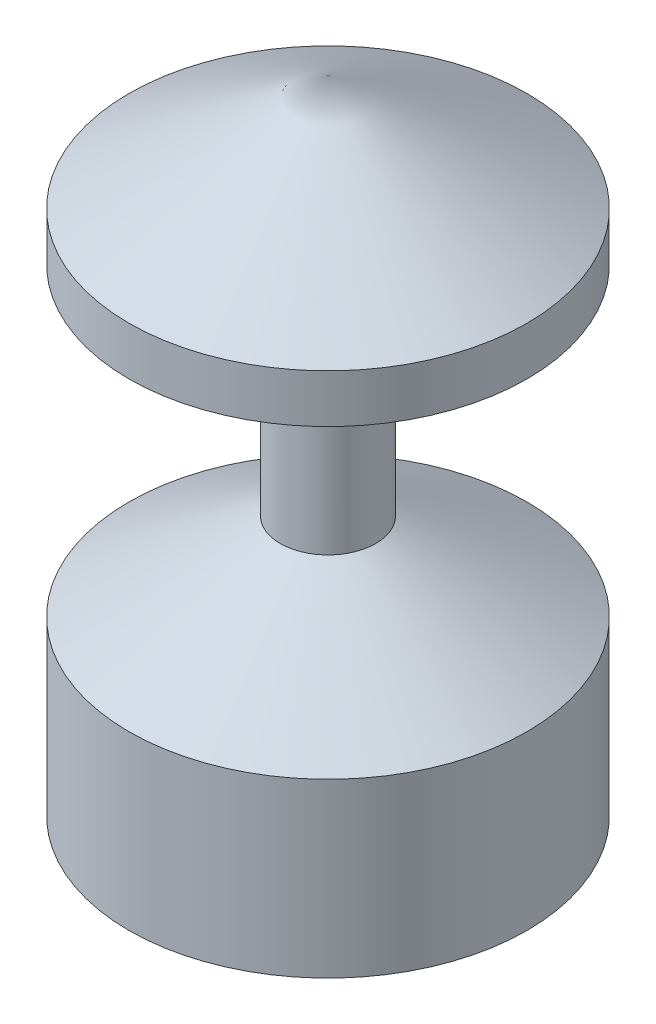
ISO-10303-21;
HEADER;
FILE_DESCRIPTION(('STEP AP214'),'2;1');
FILE_NAME('part.step','',(''),(''),'','','');
FILE_SCHEMA(('AUTOMOTIVE_DESIGN { 1 0 10303 214 1 1 1 1 }'));
ENDSEC;
DATA;
#1=APPLICATION_CONTEXT('core data for automotive mechanical design processes');
#2=APPLICATION_PROTOCOL_DEFINITION('international standard','automotive_design',2000,#1);
#3=PRODUCT_CONTEXT('',#1,'mechanical');
#4=PRODUCT('Part','Part','',(#3));
#5=PRODUCT_RELATED_PRODUCT_CATEGORY('part','',(#4));
#6=PRODUCT_DEFINITION_FORMATION('','',#4);
#7=PRODUCT_DEFINITION_CONTEXT('part definition',#1,'design');
#8=PRODUCT_DEFINITION('design','',#6,#7);
#9=PRODUCT_DEFINITION_SHAPE('','',#8);
#10=(LENGTH_UNIT() NAMED_UNIT(*) SI_UNIT(.MILLI.,.METRE.));
#11=(NAMED_UNIT(*) PLANE_ANGLE_UNIT() SI_UNIT($,.RADIAN.));
#12=(NAMED_UNIT(*) SI_UNIT($,.STERADIAN.) SOLID_ANGLE_UNIT());
#13=UNCERTAINTY_MEASURE_WITH_UNIT(LENGTH_MEASURE(1.E-05),#10,'distance_accuracy_value','');
#14=(GEOMETRIC_REPRESENTATION_CONTEXT(3) GLOBAL_UNCERTAINTY_ASSIGNED_CONTEXT((#13)) GLOBAL_UNIT_ASSIGNED_CONTEXT((#10,
#11,#12)) REPRESENTATION_CONTEXT('',''));
#15=CARTESIAN_POINT('',(0.,0.,0.));
#16=DIRECTION('',(0.,0.,1.));
#17=DIRECTION('',(1.,0.,0.));
#18=AXIS2_PLACEMENT_3D('',#15,#16,#17);
#19=CARTESIAN_POINT('',(0.,39.25,0.));
#20=DIRECTION('',(0.,-1.,0.));
#21=DIRECTION('',(0.,0.,-1.));
#22=AXIS2_PLACEMENT_3D('',#19,#20,#21);
#23=CONICAL_SURFACE('',#22,0.,1.0471975511966);
#24=CARTESIAN_POINT('',(0.,32.0331216351297,0.));
#25=DIRECTION('',(0.,1.,0.));
#26=DIRECTION('',(0.,0.,1.));
#27=AXIS2_PLACEMENT_3D('',#24,#25,#26);
#28=CIRCLE('',#27,12.5);
#29=CARTESIAN_POINT('',(0.,32.0331216351297,12.5));
#30=VERTEX_POINT('',#29);
#31=EDGE_CURVE('E11',#30,#30,#28,.T.);
#32=ORIENTED_EDGE('',*,*,#31,.T.);
#33=EDGE_LOOP('',(#32));
#34=FACE_BOUND('',#33,.T.);
#35=CARTESIAN_POINT('',(0.,39.25,0.));
#36=VERTEX_POINT('',#35);
#37=VERTEX_LOOP('',#36);
#38=FACE_BOUND('',#37,.T.);
#39=ADVANCED_FACE('F33',(#34,#38),#23,.T.);
#40=CARTESIAN_POINT('',(0.,39.25,0.));
#41=DIRECTION('',(0.,1.,0.));
#42=DIRECTION('',(0.,0.,1.));
#43=AXIS2_PLACEMENT_3D('',#40,#41,#42);
#44=CYLINDRICAL_SURFACE('',#43,12.5);
#45=CARTESIAN_POINT('',(0.,29.,0.));
#46=DIRECTION('',(0.,1.,0.));
#47=DIRECTION('',(0.,0.,1.));
#48=AXIS2_PLACEMENT_3D('',#45,#46,#47);
#49=CIRCLE('',#48,12.5);
#50=CARTESIAN_POINT('',(0.,29.,12.5));
#51=VERTEX_POINT('',#50);
#52=EDGE_CURVE('E40',#51,#51,#49,.T.);
#53=ORIENTED_EDGE('',*,*,#52,.T.);
#54=EDGE_LOOP('',(#53));
#55=FACE_BOUND('',#54,.T.);
#56=ORIENTED_EDGE('',*,*,#31,.F.);
#57=EDGE_LOOP('',(#56));
#58=FACE_BOUND('',#57,.T.);
#59=ADVANCED_FACE('F47',(#55,#58),#44,.T.);
#60=CARTESIAN_POINT('',(0.,29.,3.));
#61=DIRECTION('',(0.,-1.,0.));
#62=DIRECTION('',(0.,0.,-1.));
#63=AXIS2_PLACEMENT_3D('',#60,#61,#62);
#64=PLANE('',#63);
#65=CARTESIAN_POINT('',(0.,29.,0.));
#66=DIRECTION('',(0.,1.,0.));
#67=DIRECTION('',(0.,0.,1.));
#68=AXIS2_PLACEMENT_3D('',#65,#66,#67);
#69=CIRCLE('',#68,3.);
#70=CARTESIAN_POINT('',(0.,29.,3.));
#71=VERTEX_POINT('',#70);
#72=EDGE_CURVE('E105',#71,#71,#69,.T.);
#73=ORIENTED_EDGE('',*,*,#72,.T.);
#74=EDGE_LOOP('',(#73));
#75=FACE_BOUND('',#74,.T.);
#76=ORIENTED_EDGE('',*,*,#52,.F.);
#77=EDGE_LOOP('',(#76));
#78=FACE_BOUND('',#77,.T.);
#79=ADVANCED_FACE('F52',(#75,#78),#64,.T.);
#80=CARTESIAN_POINT('',(0.,39.25,0.));
#81=DIRECTION('',(0.,1.,0.));
#82=DIRECTION('',(0.,0.,1.));
#83=AXIS2_PLACEMENT_3D('',#80,#81,#82);
#84=CYLINDRICAL_SURFACE('',#83,3.);
#85=CARTESIAN_POINT('',(0.,15.2997821335251,0.));
#86=DIRECTION('',(0.,1.,0.));
#87=DIRECTION('',(0.,0.,1.));
#88=AXIS2_PLACEMENT_3D('',#85,#86,#87);
#89=CIRCLE('',#88,3.);
#90=CARTESIAN_POINT('',(0.,15.2997821335251,-3.));
#91=VERTEX_POINT('',#90);
#92=EDGE_CURVE('E102',#91,#91,#89,.T.);
#93=ORIENTED_EDGE('',*,*,#92,.T.);
#94=EDGE_LOOP('',(#93));
#95=FACE_BOUND('',#94,.T.);
#96=ORIENTED_EDGE('',*,*,#72,.F.);
#97=EDGE_LOOP('',(#96));
#98=FACE_BOUND('',#97,.T.);
#99=ADVANCED_FACE('F59',(#95,#98),#84,.T.);
#100=CARTESIAN_POINT('',(0.,15.2997821335251,0.));
#101=DIRECTION('',(0.,-1.,0.));
#102=DIRECTION('',(0.,0.,-1.));
#103=AXIS2_PLACEMENT_3D('',#100,#101,#102);
#104=CONICAL_SURFACE('',#103,3.,1.0471975511966);
#105=CARTESIAN_POINT('',(0.,9.81495457622364,0.));
#106=DIRECTION('',(0.,1.,0.));
#107=DIRECTION('',(0.,0.,1.));
#108=AXIS2_PLACEMENT_3D('',#105,#106,#107);
#109=CIRCLE('',#108,12.5);
#110=CARTESIAN_POINT('',(0.,9.81495457622364,-12.5));
#111=VERTEX_POINT('',#110);
#112=EDGE_CURVE('E99',#111,#111,#109,.T.);
#113=CARTESIAN_POINT('',(0.,9.81495457622364,-12.5));
#114=CARTESIAN_POINT('',(0.,9.8720881966122,-12.4010416666667));
#115=CARTESIAN_POINT('',(0.,9.92922181700075,-12.3020833333333));
#116=CARTESIAN_POINT('',(0.,10.0434890577779,-12.1041666666667));
#117=CARTESIAN_POINT('',(0.,10.1006226781664,-12.0052083333333));
#118=CARTESIAN_POINT('',(0.,10.2148899189435,-11.8072916666667));
#119=CARTESIAN_POINT('',(0.,10.2720235393321,-11.7083333333333));
#120=CARTESIAN_POINT('',(0.,10.3862907801092,-11.5104166666667));
#121=CARTESIAN_POINT('',(0.,10.4434244004978,-11.4114583333333));
#122=CARTESIAN_POINT('',(0.,10.5576916412749,-11.2135416666667));
#123=CARTESIAN_POINT('',(0.,10.6148252616634,-11.1145833333333));
#124=CARTESIAN_POINT('',(0.,10.7290925024406,-10.9166666666667));
#125=CARTESIAN_POINT('',(0.,10.7862261228291,-10.8177083333333));
#126=CARTESIAN_POINT('',(0.,10.9004933636062,-10.6197916666667));
#127=CARTESIAN_POINT('',(0.,10.9576269839948,-10.5208333333333));
#128=CARTESIAN_POINT('',(0.,11.0718942247719,-10.3229166666667));
#129=CARTESIAN_POINT('',(0.,11.1290278451605,-10.2239583333333));
#130=CARTESIAN_POINT('',(0.,11.2432950859376,-10.0260416666667));
#131=CARTESIAN_POINT('',(0.,11.3004287063261,-9.92708333333333));
#132=CARTESIAN_POINT('',(0.,11.4146959471032,-9.72916666666666));
#133=CARTESIAN_POINT('',(0.,11.4718295674918,-9.63020833333333));
#134=CARTESIAN_POINT('',(0.,11.5860968082689,-9.43229166666667));
#135=CARTESIAN_POINT('',(0.,11.6432304286575,-9.33333333333333));
#136=CARTESIAN_POINT('',(0.,11.7574976694346,-9.13541666666666));
#137=CARTESIAN_POINT('',(0.,11.8146312898231,-9.03645833333333));
#138=CARTESIAN_POINT('',(0.,11.9288985306002,-8.83854166666666));
#139=CARTESIAN_POINT('',(0.,11.9860321509888,-8.73958333333333));
#140=CARTESIAN_POINT('',(0.,12.1002993917659,-8.54166666666666));
#141=CARTESIAN_POINT('',(0.,12.1574330121545,-8.44270833333333));
#142=CARTESIAN_POINT('',(0.,12.2717002529316,-8.24479166666666));
#143=CARTESIAN_POINT('',(0.,12.3288338733201,-8.14583333333333));
#144=CARTESIAN_POINT('',(0.,12.4431011140973,-7.94791666666666));
#145=CARTESIAN_POINT('',(0.,12.5002347344858,-7.84895833333333));
#146=CARTESIAN_POINT('',(0.,12.6145019752629,-7.65104166666666));
#147=CARTESIAN_POINT('',(0.,12.6716355956515,-7.55208333333333));
#148=CARTESIAN_POINT('',(0.,12.7859028364286,-7.35416666666666));
#149=CARTESIAN_POINT('',(0.,12.8430364568172,-7.25520833333333));
#150=CARTESIAN_POINT('',(0.,12.9573036975943,-7.05729166666666));
#151=CARTESIAN_POINT('',(0.,13.0144373179828,-6.95833333333333));
#152=CARTESIAN_POINT('',(0.,13.1287045587599,-6.76041666666666));
#153=CARTESIAN_POINT('',(0.,13.1858381791485,-6.66145833333333));
#154=CARTESIAN_POINT('',(0.,13.3001054199256,-6.46354166666666));
#155=CARTESIAN_POINT('',(0.,13.3572390403142,-6.36458333333333));
#156=CARTESIAN_POINT('',(0.,13.4715062810913,-6.16666666666666));
#157=CARTESIAN_POINT('',(0.,13.5286399014798,-6.06770833333333));
#158=CARTESIAN_POINT('',(0.,13.642907142257,-5.86979166666666));
#159=CARTESIAN_POINT('',(0.,13.7000407626455,-5.77083333333333));
#160=CARTESIAN_POINT('',(0.,13.8143080034226,-5.57291666666666));
#161=CARTESIAN_POINT('',(0.,13.8714416238112,-5.47395833333333));
#162=CARTESIAN_POINT('',(0.,13.9857088645883,-5.27604166666666));
#163=CARTESIAN_POINT('',(0.,14.0428424849769,-5.17708333333333));
#164=CARTESIAN_POINT('',(0.,14.157109725754,-4.97916666666666));
#165=CARTESIAN_POINT('',(0.,14.2142433461425,-4.88020833333333));
#166=CARTESIAN_POINT('',(0.,14.3285105869196,-4.68229166666666));
#167=CARTESIAN_POINT('',(0.,14.3856442073082,-4.58333333333333));
#168=CARTESIAN_POINT('',(0.,14.4999114480853,-4.38541666666666));
#169=CARTESIAN_POINT('',(0.,14.5570450684739,-4.28645833333333));
#170=CARTESIAN_POINT('',(0.,14.671312309251,-4.08854166666666));
#171=CARTESIAN_POINT('',(0.,14.7284459296395,-3.98958333333333));
#172=CARTESIAN_POINT('',(0.,14.8427131704166,-3.79166666666666));
#173=CARTESIAN_POINT('',(0.,14.8998467908052,-3.69270833333333));
#174=CARTESIAN_POINT('',(0.,15.0141140315823,-3.49479166666666));
#175=CARTESIAN_POINT('',(0.,15.0712476519709,-3.39583333333333));
#176=CARTESIAN_POINT('',(0.,15.185514892748,-3.19791666666666));
#177=CARTESIAN_POINT('',(0.,15.2426485131365,-3.09895833333333));
#178=CARTESIAN_POINT('',(0.,15.2997821335251,-3.));
#179=B_SPLINE_CURVE_WITH_KNOTS('',3,(#113,#114,#115,#116,#117,#118,#119,#120,#121,#122,#123,
#124,#125,#126,#127,#128,#129,#130,#131,#132,#133,#134,#135,#136,#137,#138,#139,#140,#141,#142,
#143,#144,#145,#146,#147,#148,#149,#150,#151,#152,#153,#154,#155,#156,#157,#158,#159,#160,#161,
#162,#163,#164,#165,#166,#167,#168,#169,#170,#171,#172,#173,#174,#175,#176,#177,#178),
.UNSPECIFIED.,.F.,.F.,(4,2,2,2,2,2,2,2,2,2,2,2,2,2,2,2,2,2,2,2,2,2,2,2,2,2,2,2,2,2,2,2,4),(0.,
0.342801722331341,0.685603444662681,1.02840516699402,1.37120688932536,1.7140086116567,
2.05681033398804,2.39961205631938,2.74241377865073,3.08521550098207,3.42801722331341,
3.77081894564475,4.11362066797609,4.45642239030743,4.79922411263877,5.14202583497011,
5.48482755730145,5.82762927963279,6.17043100196413,6.51323272429547,6.85603444662681,
7.19883616895815,7.5416378912895,7.88443961362083,8.22724133595218,8.57004305828352,
8.91284478061486,9.2556465029462,9.59844822527754,9.94124994760888,10.2840516699402,
10.6268533922716,10.9696551146029),.UNSPECIFIED.);
#180=EDGE_CURVE('BSEAM66',#111,#91,#179,.T.);
#181=ORIENTED_EDGE('',*,*,#112,.T.);
#182=ORIENTED_EDGE('',*,*,#92,.F.);
#183=ORIENTED_EDGE('',*,*,#180,.T.);
#184=ORIENTED_EDGE('',*,*,#180,.F.);
#185=EDGE_LOOP('',(#181,#183,#182,#184));
#186=FACE_BOUND('',#185,.T.);
#187=ADVANCED_FACE('F66',(#186),#104,.T.);
#188=CARTESIAN_POINT('',(0.,39.25,0.));
#189=DIRECTION('',(0.,1.,0.));
#190=DIRECTION('',(0.,0.,1.));
#191=AXIS2_PLACEMENT_3D('',#188,#189,#190);
#192=CYLINDRICAL_SURFACE('',#191,12.5);
#193=CARTESIAN_POINT('',(0.,-1.,0.));
#194=DIRECTION('',(0.,1.,0.));
#195=DIRECTION('',(0.,0.,1.));
#196=AXIS2_PLACEMENT_3D('',#193,#194,#195);
#197=CIRCLE('',#196,12.5);
#198=CARTESIAN_POINT('',(0.,-1.,12.5));
#199=VERTEX_POINT('',#198);
#200=EDGE_CURVE('E94',#199,#199,#197,.T.);
#201=ORIENTED_EDGE('',*,*,#200,.T.);
#202=EDGE_LOOP('',(#201));
#203=FACE_BOUND('',#202,.T.);
#204=ORIENTED_EDGE('',*,*,#112,.F.);
#205=EDGE_LOOP('',(#204));
#206=FACE_BOUND('',#205,.T.);
#207=ADVANCED_FACE('F70',(#203,#206),#192,.T.);
#208=CARTESIAN_POINT('',(0.,-1.,12.5));
#209=DIRECTION('',(0.,-1.,0.));
#210=DIRECTION('',(0.,0.,-1.));
#211=AXIS2_PLACEMENT_3D('',#208,#209,#210);
#212=PLANE('',#211);
#213=CARTESIAN_POINT('',(0.,-1.,0.));
#214=DIRECTION('',(0.,1.,0.));
#215=DIRECTION('',(0.,0.,1.));
#216=AXIS2_PLACEMENT_3D('',#213,#214,#215);
#217=CIRCLE('',#216,9.5);
#218=CARTESIAN_POINT('',(0.,-1.,9.5));
#219=VERTEX_POINT('',#218);
#220=EDGE_CURVE('E91',#219,#219,#217,.T.);
#221=ORIENTED_EDGE('',*,*,#220,.T.);
#222=EDGE_LOOP('',(#221));
#223=FACE_BOUND('',#222,.T.);
#224=ORIENTED_EDGE('',*,*,#200,.F.);
#225=EDGE_LOOP('',(#224));
#226=FACE_BOUND('',#225,.T.);
#227=ADVANCED_FACE('F74',(#223,#226),#212,.T.);
#228=CARTESIAN_POINT('',(0.,39.25,0.));
#229=DIRECTION('',(0.,1.,0.));
#230=DIRECTION('',(0.,0.,1.));
#231=AXIS2_PLACEMENT_3D('',#228,#229,#230);
#232=CYLINDRICAL_SURFACE('',#231,9.5);
#233=CARTESIAN_POINT('',(0.,0.,0.));
#234=DIRECTION('',(0.,1.,0.));
#235=DIRECTION('',(0.,0.,1.));
#236=AXIS2_PLACEMENT_3D('',#233,#234,#235);
#237=CIRCLE('',#236,9.5);
#238=CARTESIAN_POINT('',(0.,0.,9.5));
#239=VERTEX_POINT('',#238);
#240=EDGE_CURVE('E90',#239,#239,#237,.T.);
#241=ORIENTED_EDGE('',*,*,#240,.T.);
#242=EDGE_LOOP('',(#241));
#243=FACE_BOUND('',#242,.T.);
#244=ORIENTED_EDGE('',*,*,#220,.F.);
#245=EDGE_LOOP('',(#244));
#246=FACE_BOUND('',#245,.T.);
#247=ADVANCED_FACE('F78',(#243,#246),#232,.F.);
#248=CARTESIAN_POINT('',(0.,0.,0.));
#249=DIRECTION('',(0.,-1.,0.));
#250=DIRECTION('',(0.,0.,-1.));
#251=AXIS2_PLACEMENT_3D('',#248,#249,#250);
#252=CONICAL_SURFACE('',#251,9.5,1.0471975511966);
#253=CARTESIAN_POINT('',(0.,5.48482755730147,0.));
#254=VERTEX_POINT('',#253);
#255=VERTEX_LOOP('',#254);
#256=FACE_BOUND('',#255,.T.);
#257=ORIENTED_EDGE('',*,*,#240,.F.);
#258=EDGE_LOOP('',(#257));
#259=FACE_BOUND('',#258,.T.);
#260=ADVANCED_FACE('F82',(#256,#259),#252,.F.);
#261=CLOSED_SHELL('',(#39,#59,#79,#99,#187,#207,#227,#247,#260));
#262=MANIFOLD_SOLID_BREP('B2',#261);
#263=ADVANCED_BREP_SHAPE_REPRESENTATION('',(#18,#262),#14);
#264=SHAPE_DEFINITION_REPRESENTATION(#9,#263);
ENDSEC;
END-ISO-10303-21;
